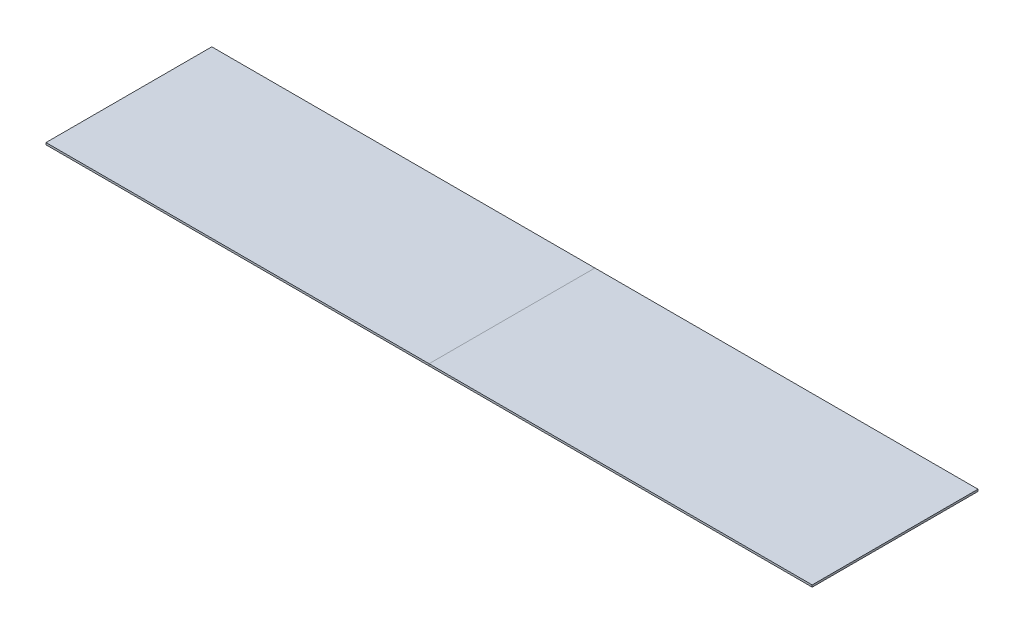
ISO-10303-21;
HEADER;
FILE_DESCRIPTION(('STEP AP214'),'2;1');
FILE_NAME('part.step','',(''),(''),'','','');
FILE_SCHEMA(('AUTOMOTIVE_DESIGN { 1 0 10303 214 1 1 1 1 }'));
ENDSEC;
DATA;
#1=APPLICATION_CONTEXT('core data for automotive mechanical design processes');
#2=APPLICATION_PROTOCOL_DEFINITION('international standard','automotive_design',2000,#1);
#3=PRODUCT_CONTEXT('',#1,'mechanical');
#4=PRODUCT('Part','Part','',(#3));
#5=PRODUCT_RELATED_PRODUCT_CATEGORY('part','',(#4));
#6=PRODUCT_DEFINITION_FORMATION('','',#4);
#7=PRODUCT_DEFINITION_CONTEXT('part definition',#1,'design');
#8=PRODUCT_DEFINITION('design','',#6,#7);
#9=PRODUCT_DEFINITION_SHAPE('','',#8);
#10=(LENGTH_UNIT() NAMED_UNIT(*) SI_UNIT(.MILLI.,.METRE.));
#11=(NAMED_UNIT(*) PLANE_ANGLE_UNIT() SI_UNIT($,.RADIAN.));
#12=(NAMED_UNIT(*) SI_UNIT($,.STERADIAN.) SOLID_ANGLE_UNIT());
#13=UNCERTAINTY_MEASURE_WITH_UNIT(LENGTH_MEASURE(1.E-05),#10,'distance_accuracy_value','');
#14=(GEOMETRIC_REPRESENTATION_CONTEXT(3) GLOBAL_UNCERTAINTY_ASSIGNED_CONTEXT((#13)) GLOBAL_UNIT_ASSIGNED_CONTEXT((#10,
#11,#12)) REPRESENTATION_CONTEXT('',''));
#15=CARTESIAN_POINT('',(0.,0.,0.));
#16=DIRECTION('',(0.,0.,1.));
#17=DIRECTION('',(1.,0.,0.));
#18=AXIS2_PLACEMENT_3D('',#15,#16,#17);
#19=CARTESIAN_POINT('',(1155.4,-0.00999999999999959,0.));
#20=DIRECTION('',(1.,0.,0.));
#21=DIRECTION('',(0.,0.,-1.));
#22=AXIS2_PLACEMENT_3D('',#19,#20,#21);
#23=PLANE('',#22);
#24=DIRECTION('',(0.,-1.,0.));
#25=VECTOR('',#24,1.);
#26=CARTESIAN_POINT('',(1155.4,6.,0.));
#27=LINE('',#26,#25);
#28=CARTESIAN_POINT('',(1155.4,6.,0.));
#29=VERTEX_POINT('',#28);
#30=CARTESIAN_POINT('',(1155.4,0.,0.));
#31=VERTEX_POINT('',#30);
#32=EDGE_CURVE('E96',#29,#31,#27,.T.);
#33=ORIENTED_EDGE('',*,*,#32,.T.);
#34=DIRECTION('',(0.,0.,-1.));
#35=VECTOR('',#34,1.);
#36=CARTESIAN_POINT('',(1155.4,0.,0.));
#37=LINE('',#36,#35);
#38=CARTESIAN_POINT('',(1155.4,0.,-500.));
#39=VERTEX_POINT('',#38);
#40=EDGE_CURVE('E89',#31,#39,#37,.T.);
#41=ORIENTED_EDGE('',*,*,#40,.T.);
#42=DIRECTION('',(0.,-1.,0.));
#43=VECTOR('',#42,1.);
#44=CARTESIAN_POINT('',(1155.4,6.,-500.));
#45=LINE('',#44,#43);
#46=CARTESIAN_POINT('',(1155.4,6.,-500.));
#47=VERTEX_POINT('',#46);
#48=EDGE_CURVE('E92',#47,#39,#45,.T.);
#49=ORIENTED_EDGE('',*,*,#48,.F.);
#50=DIRECTION('',(0.,0.,-1.));
#51=VECTOR('',#50,1.);
#52=CARTESIAN_POINT('',(1155.4,6.,0.));
#53=LINE('',#52,#51);
#54=EDGE_CURVE('E77',#29,#47,#53,.T.);
#55=ORIENTED_EDGE('',*,*,#54,.F.);
#56=EDGE_LOOP('',(#33,#41,#49,#55));
#57=FACE_BOUND('',#56,.T.);
#58=ADVANCED_FACE('F42',(#57),#23,.T.);
#59=CARTESIAN_POINT('',(0.,6.,0.));
#60=DIRECTION('',(0.,1.,0.));
#61=DIRECTION('',(0.,0.,1.));
#62=AXIS2_PLACEMENT_3D('',#59,#60,#61);
#63=PLANE('',#62);
#64=DIRECTION('',(1.,0.,0.));
#65=VECTOR('',#64,1.);
#66=CARTESIAN_POINT('',(0.,6.,0.));
#67=LINE('',#66,#65);
#68=CARTESIAN_POINT('',(0.,6.,0.));
#69=VERTEX_POINT('',#68);
#70=EDGE_CURVE('E103',#69,#29,#67,.T.);
#71=ORIENTED_EDGE('',*,*,#70,.T.);
#72=ORIENTED_EDGE('',*,*,#54,.T.);
#73=DIRECTION('',(1.,0.,0.));
#74=VECTOR('',#73,1.);
#75=CARTESIAN_POINT('',(0.,6.,-500.));
#76=LINE('',#75,#74);
#77=CARTESIAN_POINT('',(0.,6.,-500.));
#78=VERTEX_POINT('',#77);
#79=EDGE_CURVE('E94',#78,#47,#76,.T.);
#80=ORIENTED_EDGE('',*,*,#79,.F.);
#81=DIRECTION('',(0.,0.,-1.));
#82=VECTOR('',#81,1.);
#83=CARTESIAN_POINT('',(0.,6.,0.));
#84=LINE('',#83,#82);
#85=EDGE_CURVE('E105',#69,#78,#84,.T.);
#86=ORIENTED_EDGE('',*,*,#85,.F.);
#87=EDGE_LOOP('',(#71,#72,#80,#86));
#88=FACE_BOUND('',#87,.T.);
#89=ADVANCED_FACE('F115',(#88),#63,.T.);
#90=CARTESIAN_POINT('',(0.,6.,-500.));
#91=DIRECTION('',(0.,0.,-1.));
#92=DIRECTION('',(-1.,0.,0.));
#93=AXIS2_PLACEMENT_3D('',#90,#91,#92);
#94=PLANE('',#93);
#95=ORIENTED_EDGE('',*,*,#79,.T.);
#96=ORIENTED_EDGE('',*,*,#48,.T.);
#97=DIRECTION('',(1.,0.,0.));
#98=VECTOR('',#97,1.);
#99=CARTESIAN_POINT('',(0.,0.,-500.));
#100=LINE('',#99,#98);
#101=CARTESIAN_POINT('',(0.,0.,-500.));
#102=VERTEX_POINT('',#101);
#103=EDGE_CURVE('E12',#102,#39,#100,.T.);
#104=ORIENTED_EDGE('',*,*,#103,.F.);
#105=DIRECTION('',(0.,-1.,0.));
#106=VECTOR('',#105,1.);
#107=CARTESIAN_POINT('',(0.,6.,-500.));
#108=LINE('',#107,#106);
#109=EDGE_CURVE('E70',#78,#102,#108,.T.);
#110=ORIENTED_EDGE('',*,*,#109,.F.);
#111=EDGE_LOOP('',(#95,#96,#104,#110));
#112=FACE_BOUND('',#111,.T.);
#113=ADVANCED_FACE('F93',(#112),#94,.T.);
#114=CARTESIAN_POINT('',(0.,6.,0.));
#115=DIRECTION('',(0.,0.,-1.));
#116=DIRECTION('',(-1.,0.,0.));
#117=AXIS2_PLACEMENT_3D('',#114,#115,#116);
#118=PLANE('',#117);
#119=ORIENTED_EDGE('',*,*,#32,.F.);
#120=ORIENTED_EDGE('',*,*,#70,.F.);
#121=DIRECTION('',(0.,-1.,0.));
#122=VECTOR('',#121,1.);
#123=CARTESIAN_POINT('',(0.,6.,0.));
#124=LINE('',#123,#122);
#125=CARTESIAN_POINT('',(0.,0.,0.));
#126=VERTEX_POINT('',#125);
#127=EDGE_CURVE('E59',#69,#126,#124,.T.);
#128=ORIENTED_EDGE('',*,*,#127,.T.);
#129=DIRECTION('',(1.,0.,0.));
#130=VECTOR('',#129,1.);
#131=CARTESIAN_POINT('',(0.,0.,0.));
#132=LINE('',#131,#130);
#133=EDGE_CURVE('E51',#126,#31,#132,.T.);
#134=ORIENTED_EDGE('',*,*,#133,.T.);
#135=EDGE_LOOP('',(#119,#120,#128,#134));
#136=FACE_BOUND('',#135,.T.);
#137=ADVANCED_FACE('F116',(#136),#118,.F.);
#138=CARTESIAN_POINT('',(0.,0.,0.));
#139=DIRECTION('',(0.,1.,0.));
#140=DIRECTION('',(0.,0.,1.));
#141=AXIS2_PLACEMENT_3D('',#138,#139,#140);
#142=PLANE('',#141);
#143=ORIENTED_EDGE('',*,*,#40,.F.);
#144=ORIENTED_EDGE('',*,*,#133,.F.);
#145=DIRECTION('',(0.,0.,-1.));
#146=VECTOR('',#145,1.);
#147=CARTESIAN_POINT('',(0.,0.,0.));
#148=LINE('',#147,#146);
#149=EDGE_CURVE('E91',#126,#102,#148,.T.);
#150=ORIENTED_EDGE('',*,*,#149,.T.);
#151=ORIENTED_EDGE('',*,*,#103,.T.);
#152=EDGE_LOOP('',(#143,#144,#150,#151));
#153=FACE_BOUND('',#152,.T.);
#154=ADVANCED_FACE('F44',(#153),#142,.F.);
#155=CARTESIAN_POINT('',(0.,6.,0.));
#156=DIRECTION('',(-1.,0.,0.));
#157=DIRECTION('',(0.,0.,1.));
#158=AXIS2_PLACEMENT_3D('',#155,#156,#157);
#159=PLANE('',#158);
#160=ORIENTED_EDGE('',*,*,#149,.F.);
#161=ORIENTED_EDGE('',*,*,#127,.F.);
#162=ORIENTED_EDGE('',*,*,#85,.T.);
#163=ORIENTED_EDGE('',*,*,#109,.T.);
#164=EDGE_LOOP('',(#160,#161,#162,#163));
#165=FACE_BOUND('',#164,.T.);
#166=ADVANCED_FACE('F113',(#165),#159,.T.);
#167=CLOSED_SHELL('',(#58,#89,#113,#137,#154,#166));
#168=MANIFOLD_SOLID_BREP('B2',#167);
#169=CARTESIAN_POINT('',(1155.4,-0.00999999999999959,0.));
#170=DIRECTION('',(1.,0.,0.));
#171=DIRECTION('',(0.,0.,-1.));
#172=AXIS2_PLACEMENT_3D('',#169,#170,#171);
#173=PLANE('',#172);
#174=DIRECTION('',(0.,-1.,0.));
#175=VECTOR('',#174,1.);
#176=CARTESIAN_POINT('',(1155.4,6.,0.));
#177=LINE('',#176,#175);
#178=CARTESIAN_POINT('',(1155.4,6.,0.));
#179=VERTEX_POINT('',#178);
#180=CARTESIAN_POINT('',(1155.4,0.,0.));
#181=VERTEX_POINT('',#180);
#182=EDGE_CURVE('E229',#179,#181,#177,.T.);
#183=ORIENTED_EDGE('',*,*,#182,.F.);
#184=DIRECTION('',(0.,0.,-1.));
#185=VECTOR('',#184,1.);
#186=CARTESIAN_POINT('',(1155.4,6.,0.));
#187=LINE('',#186,#185);
#188=CARTESIAN_POINT('',(1155.4,6.,-500.));
#189=VERTEX_POINT('',#188);
#190=EDGE_CURVE('E40',#179,#189,#187,.T.);
#191=ORIENTED_EDGE('',*,*,#190,.T.);
#192=DIRECTION('',(0.,-1.,0.));
#193=VECTOR('',#192,1.);
#194=CARTESIAN_POINT('',(1155.4,6.,-500.));
#195=LINE('',#194,#193);
#196=CARTESIAN_POINT('',(1155.4,0.,-500.));
#197=VERTEX_POINT('',#196);
#198=EDGE_CURVE('E173',#189,#197,#195,.T.);
#199=ORIENTED_EDGE('',*,*,#198,.T.);
#200=DIRECTION('',(0.,0.,-1.));
#201=VECTOR('',#200,1.);
#202=CARTESIAN_POINT('',(1155.4,0.,0.));
#203=LINE('',#202,#201);
#204=EDGE_CURVE('E168',#181,#197,#203,.T.);
#205=ORIENTED_EDGE('',*,*,#204,.F.);
#206=EDGE_LOOP('',(#183,#191,#199,#205));
#207=FACE_BOUND('',#206,.T.);
#208=ADVANCED_FACE('F165',(#207),#173,.F.);
#209=CARTESIAN_POINT('',(0.,6.,0.));
#210=DIRECTION('',(0.,1.,0.));
#211=DIRECTION('',(0.,0.,1.));
#212=AXIS2_PLACEMENT_3D('',#209,#210,#211);
#213=PLANE('',#212);
#214=ORIENTED_EDGE('',*,*,#190,.F.);
#215=DIRECTION('',(1.,0.,0.));
#216=VECTOR('',#215,1.);
#217=CARTESIAN_POINT('',(0.,6.,0.));
#218=LINE('',#217,#216);
#219=CARTESIAN_POINT('',(2310.8,6.,0.));
#220=VERTEX_POINT('',#219);
#221=EDGE_CURVE('E215',#179,#220,#218,.T.);
#222=ORIENTED_EDGE('',*,*,#221,.T.);
#223=DIRECTION('',(0.,0.,-1.));
#224=VECTOR('',#223,1.);
#225=CARTESIAN_POINT('',(2310.8,6.,0.));
#226=LINE('',#225,#224);
#227=CARTESIAN_POINT('',(2310.8,6.,-500.));
#228=VERTEX_POINT('',#227);
#229=EDGE_CURVE('E209',#220,#228,#226,.T.);
#230=ORIENTED_EDGE('',*,*,#229,.T.);
#231=DIRECTION('',(1.,0.,0.));
#232=VECTOR('',#231,1.);
#233=CARTESIAN_POINT('',(0.,6.,-500.));
#234=LINE('',#233,#232);
#235=EDGE_CURVE('E203',#189,#228,#234,.T.);
#236=ORIENTED_EDGE('',*,*,#235,.F.);
#237=EDGE_LOOP('',(#214,#222,#230,#236));
#238=FACE_BOUND('',#237,.T.);
#239=ADVANCED_FACE('F213',(#238),#213,.T.);
#240=CARTESIAN_POINT('',(0.,6.,0.));
#241=DIRECTION('',(0.,0.,-1.));
#242=DIRECTION('',(-1.,0.,0.));
#243=AXIS2_PLACEMENT_3D('',#240,#241,#242);
#244=PLANE('',#243);
#245=ORIENTED_EDGE('',*,*,#221,.F.);
#246=ORIENTED_EDGE('',*,*,#182,.T.);
#247=DIRECTION('',(1.,0.,0.));
#248=VECTOR('',#247,1.);
#249=CARTESIAN_POINT('',(0.,0.,0.));
#250=LINE('',#249,#248);
#251=CARTESIAN_POINT('',(2310.8,0.,0.));
#252=VERTEX_POINT('',#251);
#253=EDGE_CURVE('E210',#181,#252,#250,.T.);
#254=ORIENTED_EDGE('',*,*,#253,.T.);
#255=DIRECTION('',(0.,-1.,0.));
#256=VECTOR('',#255,1.);
#257=CARTESIAN_POINT('',(2310.8,6.,0.));
#258=LINE('',#257,#256);
#259=EDGE_CURVE('E223',#220,#252,#258,.T.);
#260=ORIENTED_EDGE('',*,*,#259,.F.);
#261=EDGE_LOOP('',(#245,#246,#254,#260));
#262=FACE_BOUND('',#261,.T.);
#263=ADVANCED_FACE('F238',(#262),#244,.F.);
#264=CARTESIAN_POINT('',(0.,6.,-500.));
#265=DIRECTION('',(0.,0.,-1.));
#266=DIRECTION('',(-1.,0.,0.));
#267=AXIS2_PLACEMENT_3D('',#264,#265,#266);
#268=PLANE('',#267);
#269=ORIENTED_EDGE('',*,*,#198,.F.);
#270=ORIENTED_EDGE('',*,*,#235,.T.);
#271=DIRECTION('',(0.,-1.,0.));
#272=VECTOR('',#271,1.);
#273=CARTESIAN_POINT('',(2310.8,6.,-500.));
#274=LINE('',#273,#272);
#275=CARTESIAN_POINT('',(2310.8,0.,-500.));
#276=VERTEX_POINT('',#275);
#277=EDGE_CURVE('E207',#228,#276,#274,.T.);
#278=ORIENTED_EDGE('',*,*,#277,.T.);
#279=DIRECTION('',(1.,0.,0.));
#280=VECTOR('',#279,1.);
#281=CARTESIAN_POINT('',(0.,0.,-500.));
#282=LINE('',#281,#280);
#283=EDGE_CURVE('E232',#197,#276,#282,.T.);
#284=ORIENTED_EDGE('',*,*,#283,.F.);
#285=EDGE_LOOP('',(#269,#270,#278,#284));
#286=FACE_BOUND('',#285,.T.);
#287=ADVANCED_FACE('F205',(#286),#268,.T.);
#288=CARTESIAN_POINT('',(0.,0.,0.));
#289=DIRECTION('',(0.,1.,0.));
#290=DIRECTION('',(0.,0.,1.));
#291=AXIS2_PLACEMENT_3D('',#288,#289,#290);
#292=PLANE('',#291);
#293=ORIENTED_EDGE('',*,*,#253,.F.);
#294=ORIENTED_EDGE('',*,*,#204,.T.);
#295=ORIENTED_EDGE('',*,*,#283,.T.);
#296=DIRECTION('',(0.,0.,-1.));
#297=VECTOR('',#296,1.);
#298=CARTESIAN_POINT('',(2310.8,0.,0.));
#299=LINE('',#298,#297);
#300=EDGE_CURVE('E222',#252,#276,#299,.T.);
#301=ORIENTED_EDGE('',*,*,#300,.F.);
#302=EDGE_LOOP('',(#293,#294,#295,#301));
#303=FACE_BOUND('',#302,.T.);
#304=ADVANCED_FACE('F239',(#303),#292,.F.);
#305=CARTESIAN_POINT('',(2310.8,6.,0.));
#306=DIRECTION('',(-1.,0.,0.));
#307=DIRECTION('',(0.,0.,1.));
#308=AXIS2_PLACEMENT_3D('',#305,#306,#307);
#309=PLANE('',#308);
#310=ORIENTED_EDGE('',*,*,#300,.T.);
#311=ORIENTED_EDGE('',*,*,#277,.F.);
#312=ORIENTED_EDGE('',*,*,#229,.F.);
#313=ORIENTED_EDGE('',*,*,#259,.T.);
#314=EDGE_LOOP('',(#310,#311,#312,#313));
#315=FACE_BOUND('',#314,.T.);
#316=ADVANCED_FACE('F220',(#315),#309,.F.);
#317=CLOSED_SHELL('',(#208,#239,#263,#287,#304,#316));
#318=MANIFOLD_SOLID_BREP('B6',#317);
#319=ADVANCED_BREP_SHAPE_REPRESENTATION('',(#18,#168,#318),#14);
#320=SHAPE_DEFINITION_REPRESENTATION(#9,#319);
ENDSEC;
END-ISO-10303-21;
